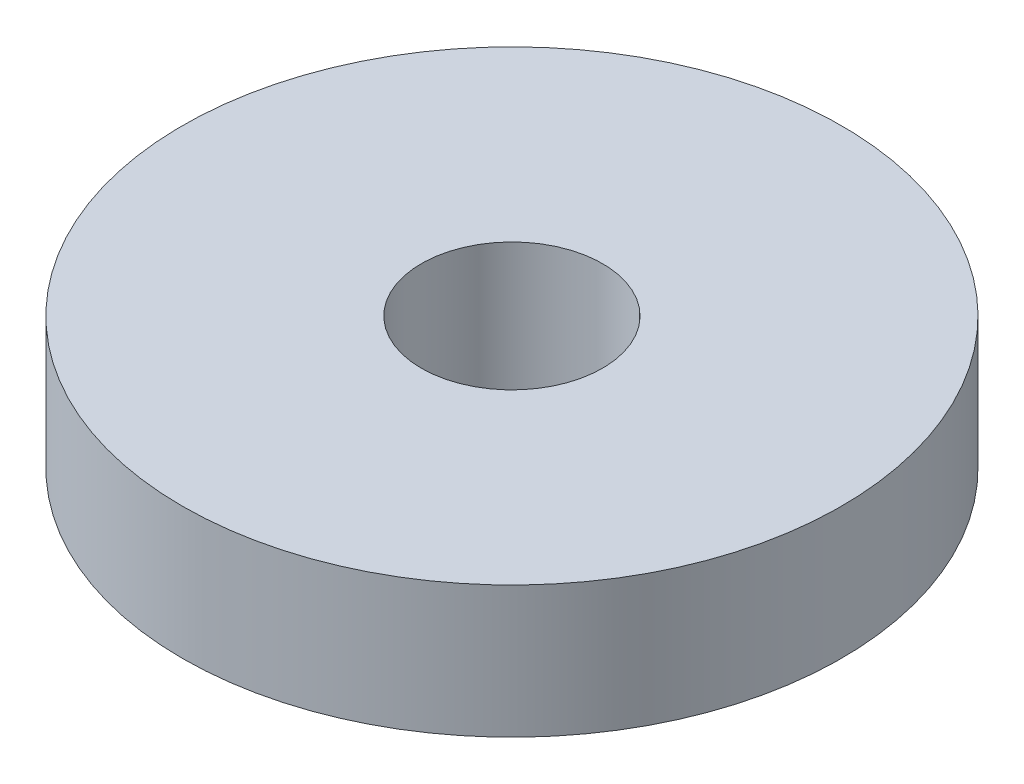
ISO-10303-21;
HEADER;
FILE_DESCRIPTION(('STEP AP214'),'2;1');
FILE_NAME('part.step','',(''),(''),'','','');
FILE_SCHEMA(('AUTOMOTIVE_DESIGN { 1 0 10303 214 1 1 1 1 }'));
ENDSEC;
DATA;
#1=APPLICATION_CONTEXT('core data for automotive mechanical design processes');
#2=APPLICATION_PROTOCOL_DEFINITION('international standard','automotive_design',2000,#1);
#3=PRODUCT_CONTEXT('',#1,'mechanical');
#4=PRODUCT('Part','Part','',(#3));
#5=PRODUCT_RELATED_PRODUCT_CATEGORY('part','',(#4));
#6=PRODUCT_DEFINITION_FORMATION('','',#4);
#7=PRODUCT_DEFINITION_CONTEXT('part definition',#1,'design');
#8=PRODUCT_DEFINITION('design','',#6,#7);
#9=PRODUCT_DEFINITION_SHAPE('','',#8);
#10=(LENGTH_UNIT() NAMED_UNIT(*) SI_UNIT(.MILLI.,.METRE.));
#11=(NAMED_UNIT(*) PLANE_ANGLE_UNIT() SI_UNIT($,.RADIAN.));
#12=(NAMED_UNIT(*) SI_UNIT($,.STERADIAN.) SOLID_ANGLE_UNIT());
#13=UNCERTAINTY_MEASURE_WITH_UNIT(LENGTH_MEASURE(1.E-05),#10,'distance_accuracy_value','');
#14=(GEOMETRIC_REPRESENTATION_CONTEXT(3) GLOBAL_UNCERTAINTY_ASSIGNED_CONTEXT((#13)) GLOBAL_UNIT_ASSIGNED_CONTEXT((#10,
#11,#12)) REPRESENTATION_CONTEXT('',''));
#15=CARTESIAN_POINT('',(0.,0.,0.));
#16=DIRECTION('',(0.,0.,1.));
#17=DIRECTION('',(1.,0.,0.));
#18=AXIS2_PLACEMENT_3D('',#15,#16,#17);
#19=CARTESIAN_POINT('',(0.,40.,0.));
#20=DIRECTION('',(0.,-1.,0.));
#21=DIRECTION('',(0.,0.,-1.));
#22=AXIS2_PLACEMENT_3D('',#19,#20,#21);
#23=CYLINDRICAL_SURFACE('',#22,100.);
#24=CARTESIAN_POINT('',(0.,40.,0.));
#25=DIRECTION('',(0.,1.,0.));
#26=DIRECTION('',(0.,0.,1.));
#27=AXIS2_PLACEMENT_3D('',#24,#25,#26);
#28=CIRCLE('',#27,100.);
#29=CARTESIAN_POINT('',(0.,40.,100.));
#30=VERTEX_POINT('',#29);
#31=EDGE_CURVE('E10',#30,#30,#28,.T.);
#32=ORIENTED_EDGE('',*,*,#31,.F.);
#33=EDGE_LOOP('',(#32));
#34=FACE_BOUND('',#33,.T.);
#35=CARTESIAN_POINT('',(0.,0.,0.));
#36=DIRECTION('',(0.,1.,0.));
#37=DIRECTION('',(0.,0.,1.));
#38=AXIS2_PLACEMENT_3D('',#35,#36,#37);
#39=CIRCLE('',#38,100.);
#40=CARTESIAN_POINT('',(0.,0.,100.));
#41=VERTEX_POINT('',#40);
#42=EDGE_CURVE('E40',#41,#41,#39,.T.);
#43=ORIENTED_EDGE('',*,*,#42,.T.);
#44=EDGE_LOOP('',(#43));
#45=FACE_BOUND('',#44,.T.);
#46=ADVANCED_FACE('F37',(#34,#45),#23,.T.);
#47=CARTESIAN_POINT('',(0.,40.,0.));
#48=DIRECTION('',(0.,1.,0.));
#49=DIRECTION('',(0.,0.,1.));
#50=AXIS2_PLACEMENT_3D('',#47,#48,#49);
#51=PLANE('',#50);
#52=CARTESIAN_POINT('',(0.,40.,0.));
#53=DIRECTION('',(0.,1.,0.));
#54=DIRECTION('',(0.,0.,1.));
#55=AXIS2_PLACEMENT_3D('',#52,#53,#54);
#56=CIRCLE('',#55,27.499999991);
#57=CARTESIAN_POINT('',(0.,40.,27.499999991));
#58=VERTEX_POINT('',#57);
#59=EDGE_CURVE('E51',#58,#58,#56,.T.);
#60=ORIENTED_EDGE('',*,*,#59,.F.);
#61=EDGE_LOOP('',(#60));
#62=FACE_BOUND('',#61,.T.);
#63=ORIENTED_EDGE('',*,*,#31,.T.);
#64=EDGE_LOOP('',(#63));
#65=FACE_BOUND('',#64,.T.);
#66=ADVANCED_FACE('F68',(#62,#65),#51,.T.);
#67=CARTESIAN_POINT('',(0.,0.,0.));
#68=DIRECTION('',(0.,1.,0.));
#69=DIRECTION('',(0.,0.,1.));
#70=AXIS2_PLACEMENT_3D('',#67,#68,#69);
#71=PLANE('',#70);
#72=CARTESIAN_POINT('',(0.,0.,0.));
#73=DIRECTION('',(0.,1.,0.));
#74=DIRECTION('',(0.,0.,1.));
#75=AXIS2_PLACEMENT_3D('',#72,#73,#74);
#76=CIRCLE('',#75,27.499999991);
#77=CARTESIAN_POINT('',(0.,0.,27.499999991));
#78=VERTEX_POINT('',#77);
#79=EDGE_CURVE('E49',#78,#78,#76,.T.);
#80=ORIENTED_EDGE('',*,*,#79,.T.);
#81=EDGE_LOOP('',(#80));
#82=FACE_BOUND('',#81,.T.);
#83=ORIENTED_EDGE('',*,*,#42,.F.);
#84=EDGE_LOOP('',(#83));
#85=FACE_BOUND('',#84,.T.);
#86=ADVANCED_FACE('F59',(#82,#85),#71,.F.);
#87=CARTESIAN_POINT('',(0.,0.,0.));
#88=DIRECTION('',(0.,1.,0.));
#89=DIRECTION('',(0.,0.,1.));
#90=AXIS2_PLACEMENT_3D('',#87,#88,#89);
#91=CYLINDRICAL_SURFACE('',#90,27.499999991);
#92=ORIENTED_EDGE('',*,*,#79,.F.);
#93=EDGE_LOOP('',(#92));
#94=FACE_BOUND('',#93,.T.);
#95=ORIENTED_EDGE('',*,*,#59,.T.);
#96=EDGE_LOOP('',(#95));
#97=FACE_BOUND('',#96,.T.);
#98=ADVANCED_FACE('F62',(#94,#97),#91,.F.);
#99=CLOSED_SHELL('',(#46,#66,#86,#98));
#100=MANIFOLD_SOLID_BREP('B2',#99);
#101=ADVANCED_BREP_SHAPE_REPRESENTATION('',(#18,#100),#14);
#102=SHAPE_DEFINITION_REPRESENTATION(#9,#101);
ENDSEC;
END-ISO-10303-21;
